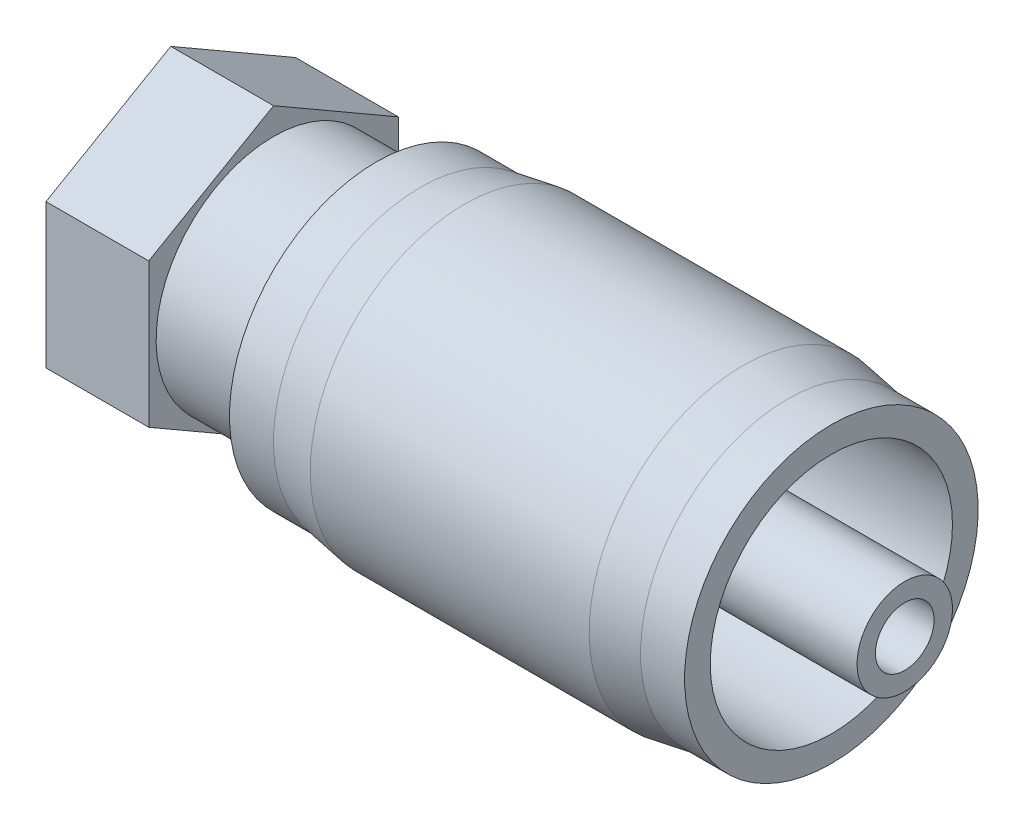
ISO-10303-21;
HEADER;
FILE_DESCRIPTION(('STEP AP214'),'2;1');
FILE_NAME('part.step','',(''),(''),'','','');
FILE_SCHEMA(('AUTOMOTIVE_DESIGN { 1 0 10303 214 1 1 1 1 }'));
ENDSEC;
DATA;
#1=APPLICATION_CONTEXT('core data for automotive mechanical design processes');
#2=APPLICATION_PROTOCOL_DEFINITION('international standard','automotive_design',2000,#1);
#3=PRODUCT_CONTEXT('',#1,'mechanical');
#4=PRODUCT('Part','Part','',(#3));
#5=PRODUCT_RELATED_PRODUCT_CATEGORY('part','',(#4));
#6=PRODUCT_DEFINITION_FORMATION('','',#4);
#7=PRODUCT_DEFINITION_CONTEXT('part definition',#1,'design');
#8=PRODUCT_DEFINITION('design','',#6,#7);
#9=PRODUCT_DEFINITION_SHAPE('','',#8);
#10=(LENGTH_UNIT() NAMED_UNIT(*) SI_UNIT(.MILLI.,.METRE.));
#11=(NAMED_UNIT(*) PLANE_ANGLE_UNIT() SI_UNIT($,.RADIAN.));
#12=(NAMED_UNIT(*) SI_UNIT($,.STERADIAN.) SOLID_ANGLE_UNIT());
#13=UNCERTAINTY_MEASURE_WITH_UNIT(LENGTH_MEASURE(1.E-05),#10,'distance_accuracy_value','');
#14=(GEOMETRIC_REPRESENTATION_CONTEXT(3) GLOBAL_UNCERTAINTY_ASSIGNED_CONTEXT((#13)) GLOBAL_UNIT_ASSIGNED_CONTEXT((#10,
#11,#12)) REPRESENTATION_CONTEXT('',''));
#15=CARTESIAN_POINT('',(0.,0.,0.));
#16=DIRECTION('',(0.,0.,1.));
#17=DIRECTION('',(1.,0.,0.));
#18=AXIS2_PLACEMENT_3D('',#15,#16,#17);
#19=CARTESIAN_POINT('',(7.,11.,0.));
#20=DIRECTION('',(1.,0.,0.));
#21=DIRECTION('',(0.,1.,0.));
#22=AXIS2_PLACEMENT_3D('',#19,#20,#21);
#23=PLANE('',#22);
#24=CARTESIAN_POINT('',(7.00000000000001,0.,0.));
#25=DIRECTION('',(1.,0.,0.));
#26=DIRECTION('',(0.,1.,0.));
#27=AXIS2_PLACEMENT_3D('',#24,#25,#26);
#28=CIRCLE('',#27,8.00000000000002);
#29=CARTESIAN_POINT('',(7.00000000000001,7.99999999999999,0.));
#30=VERTEX_POINT('',#29);
#31=EDGE_CURVE('E153',#30,#30,#28,.T.);
#32=ORIENTED_EDGE('',*,*,#31,.F.);
#33=EDGE_LOOP('',(#32));
#34=FACE_BOUND('',#33,.T.);
#35=DIRECTION('',(0.,0.5,0.866025403784439));
#36=VECTOR('',#35,1.);
#37=CARTESIAN_POINT('',(7.00000000000001,-9.81495457622364,0.));
#38=LINE('',#37,#36);
#39=CARTESIAN_POINT('',(7.00000000000001,-9.81495457622364,0.));
#40=VERTEX_POINT('',#39);
#41=CARTESIAN_POINT('',(7.00000000000001,-4.90747728811182,8.5));
#42=VERTEX_POINT('',#41);
#43=EDGE_CURVE('E93',#40,#42,#38,.T.);
#44=ORIENTED_EDGE('',*,*,#43,.F.);
#45=DIRECTION('',(0.,-0.5,0.866025403784439));
#46=VECTOR('',#45,1.);
#47=CARTESIAN_POINT('',(7.00000000000001,-4.90747728811182,-8.5));
#48=LINE('',#47,#46);
#49=CARTESIAN_POINT('',(7.00000000000001,-4.90747728811182,-8.5));
#50=VERTEX_POINT('',#49);
#51=EDGE_CURVE('E101',#50,#40,#48,.T.);
#52=ORIENTED_EDGE('',*,*,#51,.F.);
#53=DIRECTION('',(0.,-1.,0.));
#54=VECTOR('',#53,1.);
#55=CARTESIAN_POINT('',(7.00000000000001,4.90747728811182,-8.5));
#56=LINE('',#55,#54);
#57=CARTESIAN_POINT('',(7.,4.90747728811182,-8.5));
#58=VERTEX_POINT('',#57);
#59=EDGE_CURVE('E119',#58,#50,#56,.T.);
#60=ORIENTED_EDGE('',*,*,#59,.F.);
#61=DIRECTION('',(0.,-0.5,-0.866025403784439));
#62=VECTOR('',#61,1.);
#63=CARTESIAN_POINT('',(7.00000000000001,9.81495457622364,0.));
#64=LINE('',#63,#62);
#65=CARTESIAN_POINT('',(7.00000000000001,9.81495457622364,0.));
#66=VERTEX_POINT('',#65);
#67=EDGE_CURVE('E51',#66,#58,#64,.T.);
#68=ORIENTED_EDGE('',*,*,#67,.F.);
#69=DIRECTION('',(0.,0.5,-0.866025403784439));
#70=VECTOR('',#69,1.);
#71=CARTESIAN_POINT('',(7.00000000000001,4.90747728811183,8.5));
#72=LINE('',#71,#70);
#73=CARTESIAN_POINT('',(7.00000000000001,4.90747728811183,8.5));
#74=VERTEX_POINT('',#73);
#75=EDGE_CURVE('E113',#74,#66,#72,.T.);
#76=ORIENTED_EDGE('',*,*,#75,.F.);
#77=DIRECTION('',(0.,1.,0.));
#78=VECTOR('',#77,1.);
#79=CARTESIAN_POINT('',(7.00000000000001,-4.90747728811182,8.5));
#80=LINE('',#79,#78);
#81=EDGE_CURVE('E111',#42,#74,#80,.T.);
#82=ORIENTED_EDGE('',*,*,#81,.F.);
#83=EDGE_LOOP('',(#44,#52,#60,#68,#76,#82));
#84=FACE_BOUND('',#83,.T.);
#85=ADVANCED_FACE('F36',(#34,#84),#23,.T.);
#86=CARTESIAN_POINT('',(0.,11.,0.));
#87=DIRECTION('',(-1.,0.,0.));
#88=DIRECTION('',(0.,-1.,0.));
#89=AXIS2_PLACEMENT_3D('',#86,#87,#88);
#90=PLANE('',#89);
#91=CARTESIAN_POINT('',(0.,0.,0.));
#92=DIRECTION('',(1.,0.,0.));
#93=DIRECTION('',(0.,1.,0.));
#94=AXIS2_PLACEMENT_3D('',#91,#92,#93);
#95=CIRCLE('',#94,5.25000000000002);
#96=CARTESIAN_POINT('',(0.,5.24999999999999,0.));
#97=VERTEX_POINT('',#96);
#98=EDGE_CURVE('E150',#97,#97,#95,.T.);
#99=ORIENTED_EDGE('',*,*,#98,.T.);
#100=EDGE_LOOP('',(#99));
#101=FACE_BOUND('',#100,.T.);
#102=DIRECTION('',(0.,-1.,0.));
#103=VECTOR('',#102,1.);
#104=CARTESIAN_POINT('',(0.,4.90747728811182,-8.5));
#105=LINE('',#104,#103);
#106=CARTESIAN_POINT('',(0.,4.90747728811182,-8.5));
#107=VERTEX_POINT('',#106);
#108=CARTESIAN_POINT('',(0.,-4.90747728811182,-8.5));
#109=VERTEX_POINT('',#108);
#110=EDGE_CURVE('E121',#107,#109,#105,.T.);
#111=ORIENTED_EDGE('',*,*,#110,.T.);
#112=DIRECTION('',(0.,-0.5,0.866025403784439));
#113=VECTOR('',#112,1.);
#114=CARTESIAN_POINT('',(0.,-4.90747728811182,-8.5));
#115=LINE('',#114,#113);
#116=CARTESIAN_POINT('',(0.,-9.81495457622364,0.));
#117=VERTEX_POINT('',#116);
#118=EDGE_CURVE('E59',#109,#117,#115,.T.);
#119=ORIENTED_EDGE('',*,*,#118,.T.);
#120=DIRECTION('',(0.,0.5,0.866025403784438));
#121=VECTOR('',#120,1.);
#122=CARTESIAN_POINT('',(0.,-9.81495457622364,0.));
#123=LINE('',#122,#121);
#124=CARTESIAN_POINT('',(0.,-4.90747728811182,8.5));
#125=VERTEX_POINT('',#124);
#126=EDGE_CURVE('E96',#117,#125,#123,.T.);
#127=ORIENTED_EDGE('',*,*,#126,.T.);
#128=DIRECTION('',(0.,1.,0.));
#129=VECTOR('',#128,1.);
#130=CARTESIAN_POINT('',(0.,-4.90747728811182,8.5));
#131=LINE('',#130,#129);
#132=CARTESIAN_POINT('',(0.,4.90747728811182,8.5));
#133=VERTEX_POINT('',#132);
#134=EDGE_CURVE('E126',#125,#133,#131,.T.);
#135=ORIENTED_EDGE('',*,*,#134,.T.);
#136=DIRECTION('',(0.,0.5,-0.866025403784438));
#137=VECTOR('',#136,1.);
#138=CARTESIAN_POINT('',(0.,4.90747728811182,8.5));
#139=LINE('',#138,#137);
#140=CARTESIAN_POINT('',(0.,9.81495457622364,0.));
#141=VERTEX_POINT('',#140);
#142=EDGE_CURVE('E129',#133,#141,#139,.T.);
#143=ORIENTED_EDGE('',*,*,#142,.T.);
#144=DIRECTION('',(0.,-0.5,-0.866025403784439));
#145=VECTOR('',#144,1.);
#146=CARTESIAN_POINT('',(0.,9.81495457622364,0.));
#147=LINE('',#146,#145);
#148=EDGE_CURVE('E132',#141,#107,#147,.T.);
#149=ORIENTED_EDGE('',*,*,#148,.T.);
#150=EDGE_LOOP('',(#111,#119,#127,#135,#143,#149));
#151=FACE_BOUND('',#150,.T.);
#152=ADVANCED_FACE('F213',(#101,#151),#90,.T.);
#153=CARTESIAN_POINT('',(1.,4.5,0.));
#154=DIRECTION('',(-1.,0.,0.));
#155=DIRECTION('',(0.,-1.,0.));
#156=AXIS2_PLACEMENT_3D('',#153,#154,#155);
#157=PLANE('',#156);
#158=CARTESIAN_POINT('',(1.,0.,0.));
#159=DIRECTION('',(1.,0.,0.));
#160=DIRECTION('',(0.,1.,0.));
#161=AXIS2_PLACEMENT_3D('',#158,#159,#160);
#162=CIRCLE('',#161,2.00000000000004);
#163=CARTESIAN_POINT('',(1.,2.,0.));
#164=VERTEX_POINT('',#163);
#165=EDGE_CURVE('E11',#164,#164,#162,.T.);
#166=ORIENTED_EDGE('',*,*,#165,.T.);
#167=EDGE_LOOP('',(#166));
#168=FACE_BOUND('',#167,.T.);
#169=CARTESIAN_POINT('',(1.,0.,0.));
#170=DIRECTION('',(1.,0.,0.));
#171=DIRECTION('',(0.,1.,0.));
#172=AXIS2_PLACEMENT_3D('',#169,#170,#171);
#173=CIRCLE('',#172,4.50000000000004);
#174=CARTESIAN_POINT('',(1.,4.5,0.));
#175=VERTEX_POINT('',#174);
#176=EDGE_CURVE('E106',#175,#175,#173,.T.);
#177=ORIENTED_EDGE('',*,*,#176,.F.);
#178=EDGE_LOOP('',(#177));
#179=FACE_BOUND('',#178,.T.);
#180=ADVANCED_FACE('F38',(#168,#179),#157,.T.);
#181=CARTESIAN_POINT('',(92.3901877171249,0.,0.));
#182=DIRECTION('',(1.,0.,0.));
#183=DIRECTION('',(0.,1.,0.));
#184=AXIS2_PLACEMENT_3D('',#181,#182,#183);
#185=CYLINDRICAL_SURFACE('',#184,2.00000000000003);
#186=CARTESIAN_POINT('',(50.,0.,0.));
#187=DIRECTION('',(1.,0.,0.));
#188=DIRECTION('',(0.,1.,0.));
#189=AXIS2_PLACEMENT_3D('',#186,#187,#188);
#190=CIRCLE('',#189,2.00000000000002);
#191=CARTESIAN_POINT('',(50.,1.99999999999999,0.));
#192=VERTEX_POINT('',#191);
#193=EDGE_CURVE('E44',#192,#192,#190,.T.);
#194=ORIENTED_EDGE('',*,*,#193,.T.);
#195=EDGE_LOOP('',(#194));
#196=FACE_BOUND('',#195,.T.);
#197=ORIENTED_EDGE('',*,*,#165,.F.);
#198=EDGE_LOOP('',(#197));
#199=FACE_BOUND('',#198,.T.);
#200=ADVANCED_FACE('F197',(#196,#199),#185,.F.);
#201=CARTESIAN_POINT('',(50.,1.99999999999999,0.));
#202=DIRECTION('',(1.,0.,0.));
#203=DIRECTION('',(0.,1.,0.));
#204=AXIS2_PLACEMENT_3D('',#201,#202,#203);
#205=PLANE('',#204);
#206=CARTESIAN_POINT('',(50.,0.,0.));
#207=DIRECTION('',(1.,0.,0.));
#208=DIRECTION('',(0.,1.,0.));
#209=AXIS2_PLACEMENT_3D('',#206,#207,#208);
#210=CIRCLE('',#209,3.25000000000003);
#211=CARTESIAN_POINT('',(50.,3.25,0.));
#212=VERTEX_POINT('',#211);
#213=EDGE_CURVE('E192',#212,#212,#210,.T.);
#214=ORIENTED_EDGE('',*,*,#213,.T.);
#215=EDGE_LOOP('',(#214));
#216=FACE_BOUND('',#215,.T.);
#217=ORIENTED_EDGE('',*,*,#193,.F.);
#218=EDGE_LOOP('',(#217));
#219=FACE_BOUND('',#218,.T.);
#220=ADVANCED_FACE('F200',(#216,#219),#205,.T.);
#221=CARTESIAN_POINT('',(92.3901877171249,0.,0.));
#222=DIRECTION('',(1.,0.,0.));
#223=DIRECTION('',(0.,1.,0.));
#224=AXIS2_PLACEMENT_3D('',#221,#222,#223);
#225=CYLINDRICAL_SURFACE('',#224,3.25000000000003);
#226=CARTESIAN_POINT('',(24.,0.,0.));
#227=DIRECTION('',(1.,0.,0.));
#228=DIRECTION('',(0.,1.,0.));
#229=AXIS2_PLACEMENT_3D('',#226,#227,#228);
#230=CIRCLE('',#229,3.25000000000003);
#231=CARTESIAN_POINT('',(24.,3.24999999999999,0.));
#232=VERTEX_POINT('',#231);
#233=EDGE_CURVE('E189',#232,#232,#230,.T.);
#234=ORIENTED_EDGE('',*,*,#233,.T.);
#235=EDGE_LOOP('',(#234));
#236=FACE_BOUND('',#235,.T.);
#237=ORIENTED_EDGE('',*,*,#213,.F.);
#238=EDGE_LOOP('',(#237));
#239=FACE_BOUND('',#238,.T.);
#240=ADVANCED_FACE('F202',(#236,#239),#225,.T.);
#241=CARTESIAN_POINT('',(24.,3.24999999999999,0.));
#242=DIRECTION('',(1.,0.,0.));
#243=DIRECTION('',(0.,1.,0.));
#244=AXIS2_PLACEMENT_3D('',#241,#242,#243);
#245=PLANE('',#244);
#246=CARTESIAN_POINT('',(24.,0.,0.));
#247=DIRECTION('',(1.,0.,0.));
#248=DIRECTION('',(0.,1.,0.));
#249=AXIS2_PLACEMENT_3D('',#246,#247,#248);
#250=CIRCLE('',#249,8.25000000000002);
#251=CARTESIAN_POINT('',(24.,8.24999999999999,0.));
#252=VERTEX_POINT('',#251);
#253=EDGE_CURVE('E186',#252,#252,#250,.T.);
#254=ORIENTED_EDGE('',*,*,#253,.T.);
#255=EDGE_LOOP('',(#254));
#256=FACE_BOUND('',#255,.T.);
#257=ORIENTED_EDGE('',*,*,#233,.F.);
#258=EDGE_LOOP('',(#257));
#259=FACE_BOUND('',#258,.T.);
#260=ADVANCED_FACE('F209',(#256,#259),#245,.T.);
#261=CARTESIAN_POINT('',(92.3901877171249,0.,0.));
#262=DIRECTION('',(1.,0.,0.));
#263=DIRECTION('',(0.,1.,0.));
#264=AXIS2_PLACEMENT_3D('',#261,#262,#263);
#265=CYLINDRICAL_SURFACE('',#264,8.25000000000002);
#266=CARTESIAN_POINT('',(45.,0.,0.));
#267=DIRECTION('',(1.,0.,0.));
#268=DIRECTION('',(0.,1.,0.));
#269=AXIS2_PLACEMENT_3D('',#266,#267,#268);
#270=CIRCLE('',#269,8.25000000000002);
#271=CARTESIAN_POINT('',(45.,8.24999999999999,0.));
#272=VERTEX_POINT('',#271);
#273=EDGE_CURVE('E183',#272,#272,#270,.T.);
#274=ORIENTED_EDGE('',*,*,#273,.T.);
#275=EDGE_LOOP('',(#274));
#276=FACE_BOUND('',#275,.T.);
#277=ORIENTED_EDGE('',*,*,#253,.F.);
#278=EDGE_LOOP('',(#277));
#279=FACE_BOUND('',#278,.T.);
#280=ADVANCED_FACE('F264',(#276,#279),#265,.F.);
#281=CARTESIAN_POINT('',(45.,8.24999999999999,0.));
#282=DIRECTION('',(1.,0.,0.));
#283=DIRECTION('',(0.,1.,0.));
#284=AXIS2_PLACEMENT_3D('',#281,#282,#283);
#285=PLANE('',#284);
#286=CARTESIAN_POINT('',(45.,0.,0.));
#287=DIRECTION('',(1.,0.,0.));
#288=DIRECTION('',(0.,1.,0.));
#289=AXIS2_PLACEMENT_3D('',#286,#287,#288);
#290=CIRCLE('',#289,10.);
#291=CARTESIAN_POINT('',(45.,9.99999999999999,0.));
#292=VERTEX_POINT('',#291);
#293=EDGE_CURVE('E180',#292,#292,#290,.T.);
#294=ORIENTED_EDGE('',*,*,#293,.T.);
#295=EDGE_LOOP('',(#294));
#296=FACE_BOUND('',#295,.T.);
#297=ORIENTED_EDGE('',*,*,#273,.F.);
#298=EDGE_LOOP('',(#297));
#299=FACE_BOUND('',#298,.T.);
#300=ADVANCED_FACE('F260',(#296,#299),#285,.T.);
#301=CARTESIAN_POINT('',(92.3901877171249,0.,0.));
#302=DIRECTION('',(1.,0.,0.));
#303=DIRECTION('',(0.,1.,0.));
#304=AXIS2_PLACEMENT_3D('',#301,#302,#303);
#305=CYLINDRICAL_SURFACE('',#304,10.);
#306=CARTESIAN_POINT('',(42.,0.,0.));
#307=DIRECTION('',(1.,0.,0.));
#308=DIRECTION('',(0.,1.,0.));
#309=AXIS2_PLACEMENT_3D('',#306,#307,#308);
#310=CIRCLE('',#309,10.);
#311=CARTESIAN_POINT('',(42.,9.99999999999999,0.));
#312=VERTEX_POINT('',#311);
#313=EDGE_CURVE('E177',#312,#312,#310,.T.);
#314=ORIENTED_EDGE('',*,*,#313,.T.);
#315=EDGE_LOOP('',(#314));
#316=FACE_BOUND('',#315,.T.);
#317=ORIENTED_EDGE('',*,*,#293,.F.);
#318=EDGE_LOOP('',(#317));
#319=FACE_BOUND('',#318,.T.);
#320=ADVANCED_FACE('F256',(#316,#319),#305,.T.);
#321=CARTESIAN_POINT('',(42.,0.,0.));
#322=DIRECTION('',(-1.,0.,0.));
#323=DIRECTION('',(0.,-1.,0.));
#324=AXIS2_PLACEMENT_3D('',#321,#322,#323);
#325=CONICAL_SURFACE('',#324,10.,0.165148677414628);
#326=CARTESIAN_POINT('',(39.,0.,0.));
#327=DIRECTION('',(1.,0.,0.));
#328=DIRECTION('',(0.,1.,0.));
#329=AXIS2_PLACEMENT_3D('',#326,#327,#328);
#330=CIRCLE('',#329,10.5);
#331=CARTESIAN_POINT('',(39.,10.5,0.));
#332=VERTEX_POINT('',#331);
#333=EDGE_CURVE('E174',#332,#332,#330,.T.);
#334=ORIENTED_EDGE('',*,*,#333,.T.);
#335=EDGE_LOOP('',(#334));
#336=FACE_BOUND('',#335,.T.);
#337=ORIENTED_EDGE('',*,*,#313,.F.);
#338=EDGE_LOOP('',(#337));
#339=FACE_BOUND('',#338,.T.);
#340=ADVANCED_FACE('F252',(#336,#339),#325,.T.);
#341=CARTESIAN_POINT('',(92.3901877171249,0.,0.));
#342=DIRECTION('',(1.,0.,0.));
#343=DIRECTION('',(0.,1.,0.));
#344=AXIS2_PLACEMENT_3D('',#341,#342,#343);
#345=CYLINDRICAL_SURFACE('',#344,10.5);
#346=CARTESIAN_POINT('',(20.,0.,0.));
#347=DIRECTION('',(1.,0.,0.));
#348=DIRECTION('',(0.,1.,0.));
#349=AXIS2_PLACEMENT_3D('',#346,#347,#348);
#350=CIRCLE('',#349,10.5);
#351=CARTESIAN_POINT('',(20.,10.5,0.));
#352=VERTEX_POINT('',#351);
#353=EDGE_CURVE('E171',#352,#352,#350,.T.);
#354=ORIENTED_EDGE('',*,*,#353,.T.);
#355=EDGE_LOOP('',(#354));
#356=FACE_BOUND('',#355,.T.);
#357=ORIENTED_EDGE('',*,*,#333,.F.);
#358=EDGE_LOOP('',(#357));
#359=FACE_BOUND('',#358,.T.);
#360=ADVANCED_FACE('F248',(#356,#359),#345,.T.);
#361=CARTESIAN_POINT('',(20.,0.,0.));
#362=DIRECTION('',(1.,0.,0.));
#363=DIRECTION('',(0.,1.,0.));
#364=AXIS2_PLACEMENT_3D('',#361,#362,#363);
#365=CONICAL_SURFACE('',#364,10.5,0.165148677414626);
#366=CARTESIAN_POINT('',(17.,0.,0.));
#367=DIRECTION('',(1.,0.,0.));
#368=DIRECTION('',(0.,1.,0.));
#369=AXIS2_PLACEMENT_3D('',#366,#367,#368);
#370=CIRCLE('',#369,10.);
#371=CARTESIAN_POINT('',(17.,9.99999999999999,0.));
#372=VERTEX_POINT('',#371);
#373=EDGE_CURVE('E168',#372,#372,#370,.T.);
#374=ORIENTED_EDGE('',*,*,#373,.T.);
#375=EDGE_LOOP('',(#374));
#376=FACE_BOUND('',#375,.T.);
#377=ORIENTED_EDGE('',*,*,#353,.F.);
#378=EDGE_LOOP('',(#377));
#379=FACE_BOUND('',#378,.T.);
#380=ADVANCED_FACE('F244',(#376,#379),#365,.T.);
#381=CARTESIAN_POINT('',(92.3901877171249,0.,0.));
#382=DIRECTION('',(1.,0.,0.));
#383=DIRECTION('',(0.,1.,0.));
#384=AXIS2_PLACEMENT_3D('',#381,#382,#383);
#385=CYLINDRICAL_SURFACE('',#384,10.);
#386=CARTESIAN_POINT('',(14.,0.,0.));
#387=DIRECTION('',(1.,0.,0.));
#388=DIRECTION('',(0.,1.,0.));
#389=AXIS2_PLACEMENT_3D('',#386,#387,#388);
#390=CIRCLE('',#389,10.);
#391=CARTESIAN_POINT('',(14.,9.99999999999999,0.));
#392=VERTEX_POINT('',#391);
#393=EDGE_CURVE('E165',#392,#392,#390,.T.);
#394=ORIENTED_EDGE('',*,*,#393,.T.);
#395=EDGE_LOOP('',(#394));
#396=FACE_BOUND('',#395,.T.);
#397=ORIENTED_EDGE('',*,*,#373,.F.);
#398=EDGE_LOOP('',(#397));
#399=FACE_BOUND('',#398,.T.);
#400=ADVANCED_FACE('F240',(#396,#399),#385,.T.);
#401=CARTESIAN_POINT('',(14.,5.74999999999999,0.));
#402=DIRECTION('',(-1.,0.,0.));
#403=DIRECTION('',(0.,-1.,0.));
#404=AXIS2_PLACEMENT_3D('',#401,#402,#403);
#405=PLANE('',#404);
#406=CARTESIAN_POINT('',(14.,0.,0.));
#407=DIRECTION('',(1.,0.,0.));
#408=DIRECTION('',(0.,1.,0.));
#409=AXIS2_PLACEMENT_3D('',#406,#407,#408);
#410=CIRCLE('',#409,5.75000000000002);
#411=CARTESIAN_POINT('',(14.,5.74999999999999,0.));
#412=VERTEX_POINT('',#411);
#413=EDGE_CURVE('E162',#412,#412,#410,.T.);
#414=ORIENTED_EDGE('',*,*,#413,.T.);
#415=EDGE_LOOP('',(#414));
#416=FACE_BOUND('',#415,.T.);
#417=ORIENTED_EDGE('',*,*,#393,.F.);
#418=EDGE_LOOP('',(#417));
#419=FACE_BOUND('',#418,.T.);
#420=ADVANCED_FACE('F236',(#416,#419),#405,.T.);
#421=CARTESIAN_POINT('',(92.3901877171249,0.,0.));
#422=DIRECTION('',(1.,0.,0.));
#423=DIRECTION('',(0.,1.,0.));
#424=AXIS2_PLACEMENT_3D('',#421,#422,#423);
#425=CYLINDRICAL_SURFACE('',#424,5.75000000000002);
#426=CARTESIAN_POINT('',(13.,0.,0.));
#427=DIRECTION('',(1.,0.,0.));
#428=DIRECTION('',(0.,1.,0.));
#429=AXIS2_PLACEMENT_3D('',#426,#427,#428);
#430=CIRCLE('',#429,5.75000000000002);
#431=CARTESIAN_POINT('',(13.,5.74999999999999,0.));
#432=VERTEX_POINT('',#431);
#433=EDGE_CURVE('E159',#432,#432,#430,.T.);
#434=ORIENTED_EDGE('',*,*,#433,.T.);
#435=EDGE_LOOP('',(#434));
#436=FACE_BOUND('',#435,.T.);
#437=ORIENTED_EDGE('',*,*,#413,.F.);
#438=EDGE_LOOP('',(#437));
#439=FACE_BOUND('',#438,.T.);
#440=ADVANCED_FACE('F232',(#436,#439),#425,.T.);
#441=CARTESIAN_POINT('',(13.,5.74999999999999,0.));
#442=DIRECTION('',(1.,0.,0.));
#443=DIRECTION('',(0.,1.,0.));
#444=AXIS2_PLACEMENT_3D('',#441,#442,#443);
#445=PLANE('',#444);
#446=CARTESIAN_POINT('',(13.,0.,0.));
#447=DIRECTION('',(1.,0.,0.));
#448=DIRECTION('',(0.,1.,0.));
#449=AXIS2_PLACEMENT_3D('',#446,#447,#448);
#450=CIRCLE('',#449,8.00000000000002);
#451=CARTESIAN_POINT('',(13.,7.99999999999999,0.));
#452=VERTEX_POINT('',#451);
#453=EDGE_CURVE('E156',#452,#452,#450,.T.);
#454=ORIENTED_EDGE('',*,*,#453,.T.);
#455=EDGE_LOOP('',(#454));
#456=FACE_BOUND('',#455,.T.);
#457=ORIENTED_EDGE('',*,*,#433,.F.);
#458=EDGE_LOOP('',(#457));
#459=FACE_BOUND('',#458,.T.);
#460=ADVANCED_FACE('F228',(#456,#459),#445,.T.);
#461=CARTESIAN_POINT('',(92.3901877171249,0.,0.));
#462=DIRECTION('',(1.,0.,0.));
#463=DIRECTION('',(0.,1.,0.));
#464=AXIS2_PLACEMENT_3D('',#461,#462,#463);
#465=CYLINDRICAL_SURFACE('',#464,8.00000000000002);
#466=ORIENTED_EDGE('',*,*,#31,.T.);
#467=EDGE_LOOP('',(#466));
#468=FACE_BOUND('',#467,.T.);
#469=ORIENTED_EDGE('',*,*,#453,.F.);
#470=EDGE_LOOP('',(#469));
#471=FACE_BOUND('',#470,.T.);
#472=ADVANCED_FACE('F224',(#468,#471),#465,.T.);
#473=CARTESIAN_POINT('',(92.3901877171249,0.,0.));
#474=DIRECTION('',(1.,0.,0.));
#475=DIRECTION('',(0.,1.,0.));
#476=AXIS2_PLACEMENT_3D('',#473,#474,#475);
#477=CYLINDRICAL_SURFACE('',#476,5.25000000000002);
#478=CARTESIAN_POINT('',(8.00000000000001,0.,0.));
#479=DIRECTION('',(1.,0.,0.));
#480=DIRECTION('',(0.,1.,0.));
#481=AXIS2_PLACEMENT_3D('',#478,#479,#480);
#482=CIRCLE('',#481,5.25000000000002);
#483=CARTESIAN_POINT('',(8.00000000000001,5.24999999999999,0.));
#484=VERTEX_POINT('',#483);
#485=EDGE_CURVE('E147',#484,#484,#482,.T.);
#486=ORIENTED_EDGE('',*,*,#485,.T.);
#487=EDGE_LOOP('',(#486));
#488=FACE_BOUND('',#487,.T.);
#489=ORIENTED_EDGE('',*,*,#98,.F.);
#490=EDGE_LOOP('',(#489));
#491=FACE_BOUND('',#490,.T.);
#492=ADVANCED_FACE('F227',(#488,#491),#477,.F.);
#493=CARTESIAN_POINT('',(8.,5.24999999999999,0.));
#494=DIRECTION('',(-1.,0.,0.));
#495=DIRECTION('',(0.,-1.,0.));
#496=AXIS2_PLACEMENT_3D('',#493,#494,#495);
#497=PLANE('',#496);
#498=CARTESIAN_POINT('',(8.00000000000001,0.,0.));
#499=DIRECTION('',(1.,0.,0.));
#500=DIRECTION('',(0.,1.,0.));
#501=AXIS2_PLACEMENT_3D('',#498,#499,#500);
#502=CIRCLE('',#501,4.50000000000004);
#503=CARTESIAN_POINT('',(8.00000000000001,4.5,0.));
#504=VERTEX_POINT('',#503);
#505=EDGE_CURVE('E144',#504,#504,#502,.T.);
#506=ORIENTED_EDGE('',*,*,#505,.T.);
#507=EDGE_LOOP('',(#506));
#508=FACE_BOUND('',#507,.T.);
#509=ORIENTED_EDGE('',*,*,#485,.F.);
#510=EDGE_LOOP('',(#509));
#511=FACE_BOUND('',#510,.T.);
#512=ADVANCED_FACE('F332',(#508,#511),#497,.T.);
#513=CARTESIAN_POINT('',(92.3901877171249,0.,0.));
#514=DIRECTION('',(1.,0.,0.));
#515=DIRECTION('',(0.,1.,0.));
#516=AXIS2_PLACEMENT_3D('',#513,#514,#515);
#517=CYLINDRICAL_SURFACE('',#516,4.50000000000004);
#518=ORIENTED_EDGE('',*,*,#176,.T.);
#519=EDGE_LOOP('',(#518));
#520=FACE_BOUND('',#519,.T.);
#521=ORIENTED_EDGE('',*,*,#505,.F.);
#522=EDGE_LOOP('',(#521));
#523=FACE_BOUND('',#522,.T.);
#524=ADVANCED_FACE('F338',(#520,#523),#517,.T.);
#525=CARTESIAN_POINT('',(50.001,-4.90747728811182,-8.5));
#526=DIRECTION('',(0.,-0.866025403784439,-0.5));
#527=DIRECTION('',(0.,0.5,-0.866025403784439));
#528=AXIS2_PLACEMENT_3D('',#525,#526,#527);
#529=PLANE('',#528);
#530=ORIENTED_EDGE('',*,*,#51,.T.);
#531=DIRECTION('',(-1.,0.,0.));
#532=VECTOR('',#531,1.);
#533=CARTESIAN_POINT('',(50.001,-9.81495457622364,0.));
#534=LINE('',#533,#532);
#535=EDGE_CURVE('E89',#40,#117,#534,.T.);
#536=ORIENTED_EDGE('',*,*,#535,.T.);
#537=ORIENTED_EDGE('',*,*,#118,.F.);
#538=DIRECTION('',(-1.,0.,0.));
#539=VECTOR('',#538,1.);
#540=CARTESIAN_POINT('',(50.001,-4.90747728811182,-8.5));
#541=LINE('',#540,#539);
#542=EDGE_CURVE('E98',#50,#109,#541,.T.);
#543=ORIENTED_EDGE('',*,*,#542,.F.);
#544=EDGE_LOOP('',(#530,#536,#537,#543));
#545=FACE_BOUND('',#544,.T.);
#546=ADVANCED_FACE('F102',(#545),#529,.T.);
#547=CARTESIAN_POINT('',(50.001,-9.81495457622364,0.));
#548=DIRECTION('',(0.,-0.866025403784438,0.5));
#549=DIRECTION('',(0.,-0.5,-0.866025403784439));
#550=AXIS2_PLACEMENT_3D('',#547,#548,#549);
#551=PLANE('',#550);
#552=ORIENTED_EDGE('',*,*,#43,.T.);
#553=DIRECTION('',(-1.,0.,0.));
#554=VECTOR('',#553,1.);
#555=CARTESIAN_POINT('',(50.001,-4.90747728811182,8.5));
#556=LINE('',#555,#554);
#557=EDGE_CURVE('E97',#42,#125,#556,.T.);
#558=ORIENTED_EDGE('',*,*,#557,.T.);
#559=ORIENTED_EDGE('',*,*,#126,.F.);
#560=ORIENTED_EDGE('',*,*,#535,.F.);
#561=EDGE_LOOP('',(#552,#558,#559,#560));
#562=FACE_BOUND('',#561,.T.);
#563=ADVANCED_FACE('F91',(#562),#551,.T.);
#564=CARTESIAN_POINT('',(50.001,-4.90747728811182,8.5));
#565=DIRECTION('',(0.,0.,1.));
#566=DIRECTION('',(1.,0.,0.));
#567=AXIS2_PLACEMENT_3D('',#564,#565,#566);
#568=PLANE('',#567);
#569=ORIENTED_EDGE('',*,*,#81,.T.);
#570=DIRECTION('',(-1.,0.,0.));
#571=VECTOR('',#570,1.);
#572=CARTESIAN_POINT('',(50.001,4.90747728811183,8.5));
#573=LINE('',#572,#571);
#574=EDGE_CURVE('E138',#74,#133,#573,.T.);
#575=ORIENTED_EDGE('',*,*,#574,.T.);
#576=ORIENTED_EDGE('',*,*,#134,.F.);
#577=ORIENTED_EDGE('',*,*,#557,.F.);
#578=EDGE_LOOP('',(#569,#575,#576,#577));
#579=FACE_BOUND('',#578,.T.);
#580=ADVANCED_FACE('F360',(#579),#568,.T.);
#581=CARTESIAN_POINT('',(50.001,4.90747728811183,8.5));
#582=DIRECTION('',(0.,0.866025403784439,0.5));
#583=DIRECTION('',(0.,-0.5,0.866025403784439));
#584=AXIS2_PLACEMENT_3D('',#581,#582,#583);
#585=PLANE('',#584);
#586=ORIENTED_EDGE('',*,*,#75,.T.);
#587=DIRECTION('',(-1.,0.,0.));
#588=VECTOR('',#587,1.);
#589=CARTESIAN_POINT('',(50.001,9.81495457622364,0.));
#590=LINE('',#589,#588);
#591=EDGE_CURVE('E136',#66,#141,#590,.T.);
#592=ORIENTED_EDGE('',*,*,#591,.T.);
#593=ORIENTED_EDGE('',*,*,#142,.F.);
#594=ORIENTED_EDGE('',*,*,#574,.F.);
#595=EDGE_LOOP('',(#586,#592,#593,#594));
#596=FACE_BOUND('',#595,.T.);
#597=ADVANCED_FACE('F367',(#596),#585,.T.);
#598=CARTESIAN_POINT('',(50.001,9.81495457622364,0.));
#599=DIRECTION('',(0.,0.866025403784439,-0.5));
#600=DIRECTION('',(0.,0.5,0.866025403784439));
#601=AXIS2_PLACEMENT_3D('',#598,#599,#600);
#602=PLANE('',#601);
#603=ORIENTED_EDGE('',*,*,#67,.T.);
#604=DIRECTION('',(-1.,0.,0.));
#605=VECTOR('',#604,1.);
#606=CARTESIAN_POINT('',(50.001,4.90747728811182,-8.5));
#607=LINE('',#606,#605);
#608=EDGE_CURVE('E107',#58,#107,#607,.T.);
#609=ORIENTED_EDGE('',*,*,#608,.T.);
#610=ORIENTED_EDGE('',*,*,#148,.F.);
#611=ORIENTED_EDGE('',*,*,#591,.F.);
#612=EDGE_LOOP('',(#603,#609,#610,#611));
#613=FACE_BOUND('',#612,.T.);
#614=ADVANCED_FACE('F375',(#613),#602,.T.);
#615=CARTESIAN_POINT('',(50.001,4.90747728811182,-8.5));
#616=DIRECTION('',(0.,0.,-1.));
#617=DIRECTION('',(0.,1.,0.));
#618=AXIS2_PLACEMENT_3D('',#615,#616,#617);
#619=PLANE('',#618);
#620=ORIENTED_EDGE('',*,*,#59,.T.);
#621=ORIENTED_EDGE('',*,*,#542,.T.);
#622=ORIENTED_EDGE('',*,*,#110,.F.);
#623=ORIENTED_EDGE('',*,*,#608,.F.);
#624=EDGE_LOOP('',(#620,#621,#622,#623));
#625=FACE_BOUND('',#624,.T.);
#626=ADVANCED_FACE('F383',(#625),#619,.T.);
#627=CLOSED_SHELL('',(#85,#152,#180,#200,#220,#240,#260,#280,#300,#320,#340,#360,#380,#400,#420,
#440,#460,#472,#492,#512,#524,#546,#563,#580,#597,#614,#626));
#628=MANIFOLD_SOLID_BREP('B2',#627);
#629=ADVANCED_BREP_SHAPE_REPRESENTATION('',(#18,#628),#14);
#630=SHAPE_DEFINITION_REPRESENTATION(#9,#629);
ENDSEC;
END-ISO-10303-21;
